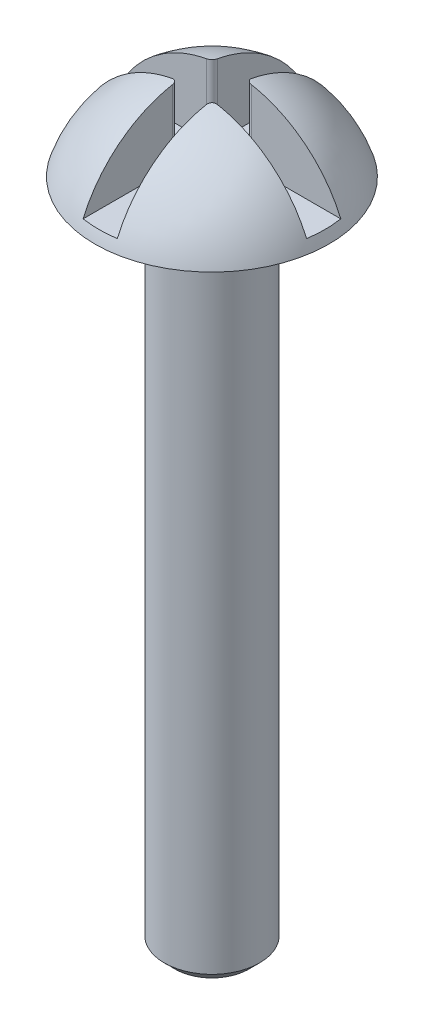
ISO-10303-21;
HEADER;
FILE_DESCRIPTION(('STEP AP214'),'2;1');
FILE_NAME('part.step','',(''),(''),'','','');
FILE_SCHEMA(('AUTOMOTIVE_DESIGN { 1 0 10303 214 1 1 1 1 }'));
ENDSEC;
DATA;
#1=APPLICATION_CONTEXT('core data for automotive mechanical design processes');
#2=APPLICATION_PROTOCOL_DEFINITION('international standard','automotive_design',2000,#1);
#3=PRODUCT_CONTEXT('',#1,'mechanical');
#4=PRODUCT('Part','Part','',(#3));
#5=PRODUCT_RELATED_PRODUCT_CATEGORY('part','',(#4));
#6=PRODUCT_DEFINITION_FORMATION('','',#4);
#7=PRODUCT_DEFINITION_CONTEXT('part definition',#1,'design');
#8=PRODUCT_DEFINITION('design','',#6,#7);
#9=PRODUCT_DEFINITION_SHAPE('','',#8);
#10=(LENGTH_UNIT() NAMED_UNIT(*) SI_UNIT(.MILLI.,.METRE.));
#11=(NAMED_UNIT(*) PLANE_ANGLE_UNIT() SI_UNIT($,.RADIAN.));
#12=(NAMED_UNIT(*) SI_UNIT($,.STERADIAN.) SOLID_ANGLE_UNIT());
#13=UNCERTAINTY_MEASURE_WITH_UNIT(LENGTH_MEASURE(1.E-05),#10,'distance_accuracy_value','');
#14=(GEOMETRIC_REPRESENTATION_CONTEXT(3) GLOBAL_UNCERTAINTY_ASSIGNED_CONTEXT((#13)) GLOBAL_UNIT_ASSIGNED_CONTEXT((#10,
#11,#12)) REPRESENTATION_CONTEXT('',''));
#15=CARTESIAN_POINT('',(0.,0.,0.));
#16=DIRECTION('',(0.,0.,1.));
#17=DIRECTION('',(1.,0.,0.));
#18=AXIS2_PLACEMENT_3D('',#15,#16,#17);
#19=CARTESIAN_POINT('',(0.,-0.8874521875,0.));
#20=DIRECTION('',(0.,1.,0.));
#21=DIRECTION('',(0.,0.,-1.));
#22=AXIS2_PLACEMENT_3D('',#19,#20,#21);
#23=SPHERICAL_SURFACE('',#22,2.9194521875);
#24=CARTESIAN_POINT('',(0.,0.,0.));
#25=DIRECTION('',(0.,1.,0.));
#26=DIRECTION('',(0.,0.,1.));
#27=AXIS2_PLACEMENT_3D('',#24,#25,#26);
#28=CIRCLE('',#27,2.7813);
#29=CARTESIAN_POINT('',(0.,0.,2.7813));
#30=VERTEX_POINT('',#29);
#31=EDGE_CURVE('E141',#30,#30,#28,.T.);
#32=ORIENTED_EDGE('',*,*,#31,.T.);
#33=EDGE_LOOP('',(#32));
#34=FACE_BOUND('',#33,.T.);
#35=CARTESIAN_POINT('',(0.,-0.8874521875,0.4064));
#36=DIRECTION('',(0.,0.,-1.));
#37=DIRECTION('',(-1.,0.,0.));
#38=AXIS2_PLACEMENT_3D('',#35,#36,#37);
#39=CIRCLE('',#38,2.89102751891063);
#40=CARTESIAN_POINT('',(0.5334,1.95394263812676,0.4064));
#41=VERTEX_POINT('',#40);
#42=CARTESIAN_POINT('',(2.65614890748806,0.254,0.4064));
#43=VERTEX_POINT('',#42);
#44=EDGE_CURVE('E130',#41,#43,#39,.T.);
#45=ORIENTED_EDGE('',*,*,#44,.F.);
#46=CARTESIAN_POINT('',(0.5334,1.95394263812676,0.4064));
#47=CARTESIAN_POINT('',(0.526429818175139,1.95525229722327,0.406393656141367));
#48=CARTESIAN_POINT('',(0.519437835446964,1.95645509605652,0.406973594128656));
#49=CARTESIAN_POINT('',(0.505606235655716,1.95861553609979,0.4092821138562));
#50=CARTESIAN_POINT('',(0.498766646008504,1.95957313351748,0.411010900579816));
#51=CARTESIAN_POINT('',(0.485430256638656,1.96121224794666,0.41559599247346));
#52=CARTESIAN_POINT('',(0.478933887553856,1.96189342496913,0.418453677685523));
#53=CARTESIAN_POINT('',(0.466492205552098,1.96295524916309,0.425222198161783));
#54=CARTESIAN_POINT('',(0.460546593915372,1.96333606009944,0.429132457981764));
#55=CARTESIAN_POINT('',(0.449486927445761,1.96378044826487,0.437816878775803));
#56=CARTESIAN_POINT('',(0.444359620352882,1.96384971613864,0.442573878351436));
#57=CARTESIAN_POINT('',(0.434956144691681,1.96368421809729,0.45286200159492));
#58=CARTESIAN_POINT('',(0.430680051299517,1.96344942534235,0.458393193563276));
#59=CARTESIAN_POINT('',(0.423132521628344,1.96268707574739,0.470014757316168));
#60=CARTESIAN_POINT('',(0.419852633333455,1.96216209494732,0.47609982079818));
#61=CARTESIAN_POINT('',(0.414329348110143,1.9608378635328,0.488695976120198));
#62=CARTESIAN_POINT('',(0.412085879160701,1.96003863198283,0.495207038321548));
#63=CARTESIAN_POINT('',(0.409056788031691,1.95839420105987,0.507011870443117));
#64=CARTESIAN_POINT('',(0.4080593321899,1.95759753777458,0.51225938370448));
#65=CARTESIAN_POINT('',(0.406730640863846,1.95586838945596,0.522808202103091));
#66=CARTESIAN_POINT('',(0.406398441009912,1.9549361031323,0.528109418162684));
#67=CARTESIAN_POINT('',(0.406399999999747,1.95394263812875,0.533400000000212));
#68=B_SPLINE_CURVE_WITH_KNOTS('',3,(#46,#47,#48,#49,#50,#51,#52,#53,#54,#55,#56,#57,#58,#59,#60,
#61,#62,#63,#64,#65,#66,#67),.UNSPECIFIED.,.F.,.F.,(4,2,2,2,2,2,2,2,2,2,4),(0.,
0.0212545383082465,0.0425128699765531,0.0637972700923001,0.0850700575426839,0.105952655327571,
0.126837096571577,0.147539053766297,0.168239572160783,0.184399511119075,0.200536007268686),.UNSPECIFIED.);
#69=CARTESIAN_POINT('',(0.4064,1.95394263812676,0.533399999999999));
#70=VERTEX_POINT('',#69);
#71=EDGE_CURVE('E199',#41,#70,#68,.T.);
#72=ORIENTED_EDGE('',*,*,#71,.T.);
#73=CARTESIAN_POINT('',(0.4064,-0.8874521875,0.));
#74=DIRECTION('',(-1.,0.,0.));
#75=DIRECTION('',(0.,0.,1.));
#76=AXIS2_PLACEMENT_3D('',#73,#74,#75);
#77=CIRCLE('',#76,2.89102751891063);
#78=CARTESIAN_POINT('',(0.4064,0.254,2.65614890748806));
#79=VERTEX_POINT('',#78);
#80=EDGE_CURVE('E157',#79,#70,#77,.T.);
#81=ORIENTED_EDGE('',*,*,#80,.F.);
#82=CARTESIAN_POINT('',(0.,0.254,0.));
#83=DIRECTION('',(0.,-1.,0.));
#84=DIRECTION('',(0.,0.,-1.));
#85=AXIS2_PLACEMENT_3D('',#82,#83,#84);
#86=CIRCLE('',#85,2.68705935527111);
#87=CARTESIAN_POINT('',(-0.4064,0.254,2.65614890748806));
#88=VERTEX_POINT('',#87);
#89=EDGE_CURVE('E133',#79,#88,#86,.T.);
#90=ORIENTED_EDGE('',*,*,#89,.T.);
#91=CARTESIAN_POINT('',(-0.4064,-0.8874521875,0.));
#92=DIRECTION('',(1.,0.,0.));
#93=DIRECTION('',(0.,0.,-1.));
#94=AXIS2_PLACEMENT_3D('',#91,#92,#93);
#95=CIRCLE('',#94,2.89102751891063);
#96=CARTESIAN_POINT('',(-0.4064,1.95394263812676,0.5334));
#97=VERTEX_POINT('',#96);
#98=EDGE_CURVE('E163',#97,#88,#95,.T.);
#99=ORIENTED_EDGE('',*,*,#98,.F.);
#100=CARTESIAN_POINT('',(-0.4064,1.95394263812676,0.5334));
#101=CARTESIAN_POINT('',(-0.406393656141367,1.95525229722327,0.526429818175139));
#102=CARTESIAN_POINT('',(-0.406973594128656,1.95645509605652,0.519437835446964));
#103=CARTESIAN_POINT('',(-0.4092821138562,1.95861553609979,0.505606235655716));
#104=CARTESIAN_POINT('',(-0.411010900579817,1.95957313351748,0.498766646008504));
#105=CARTESIAN_POINT('',(-0.41559599247346,1.96121224794666,0.485430256638656));
#106=CARTESIAN_POINT('',(-0.418453677685524,1.96189342496913,0.478933887553856));
#107=CARTESIAN_POINT('',(-0.425222198161783,1.96295524916309,0.466492205552098));
#108=CARTESIAN_POINT('',(-0.429132457981765,1.96333606009944,0.460546593915372));
#109=CARTESIAN_POINT('',(-0.437816878775803,1.96378044826487,0.449486927445761));
#110=CARTESIAN_POINT('',(-0.442573878351437,1.96384971613864,0.444359620352882));
#111=CARTESIAN_POINT('',(-0.452862001594921,1.96368421809729,0.434956144691681));
#112=CARTESIAN_POINT('',(-0.458393193563277,1.96344942534234,0.430680051299517));
#113=CARTESIAN_POINT('',(-0.470014757316169,1.96268707574739,0.423132521628344));
#114=CARTESIAN_POINT('',(-0.47609982079818,1.96216209494732,0.419852633333455));
#115=CARTESIAN_POINT('',(-0.488695976120198,1.9608378635328,0.414329348110143));
#116=CARTESIAN_POINT('',(-0.495207038321549,1.96003863198283,0.4120858791607));
#117=CARTESIAN_POINT('',(-0.507011870443117,1.95839420105987,0.409056788031691));
#118=CARTESIAN_POINT('',(-0.51225938370448,1.95759753777458,0.4080593321899));
#119=CARTESIAN_POINT('',(-0.522808202103091,1.95586838945596,0.406730640863846));
#120=CARTESIAN_POINT('',(-0.528109418162684,1.9549361031323,0.406398441009912));
#121=CARTESIAN_POINT('',(-0.533400000000212,1.95394263812875,0.406399999999747));
#122=B_SPLINE_CURVE_WITH_KNOTS('',3,(#100,#101,#102,#103,#104,#105,#106,#107,#108,#109,#110,
#111,#112,#113,#114,#115,#116,#117,#118,#119,#120,#121),.UNSPECIFIED.,.F.,.F.,(4,2,2,2,2,2,2,2,
2,2,4),(0.,0.0212545383082466,0.0425128699765532,0.0637972700923003,0.0850700575426841,
0.105952655327572,0.126837096571577,0.147539053766297,0.168239572160783,0.184399511119075,
0.200536007268686),.UNSPECIFIED.);
#123=CARTESIAN_POINT('',(-0.5334,1.95394263812676,0.4064));
#124=VERTEX_POINT('',#123);
#125=EDGE_CURVE('E177',#97,#124,#122,.T.);
#126=ORIENTED_EDGE('',*,*,#125,.T.);
#127=CARTESIAN_POINT('',(0.,-0.8874521875,0.4064));
#128=DIRECTION('',(0.,0.,-1.));
#129=DIRECTION('',(-1.,0.,0.));
#130=AXIS2_PLACEMENT_3D('',#127,#128,#129);
#131=CIRCLE('',#130,2.89102751891063);
#132=CARTESIAN_POINT('',(-2.65614890748806,0.254,0.4064));
#133=VERTEX_POINT('',#132);
#134=EDGE_CURVE('E160',#133,#124,#131,.T.);
#135=ORIENTED_EDGE('',*,*,#134,.F.);
#136=CARTESIAN_POINT('',(-2.65614890748806,0.254,-0.4064));
#137=VERTEX_POINT('',#136);
#138=EDGE_CURVE('E131',#133,#137,#86,.T.);
#139=ORIENTED_EDGE('',*,*,#138,.T.);
#140=CARTESIAN_POINT('',(0.,-0.8874521875,-0.406399999999999));
#141=DIRECTION('',(0.,0.,1.));
#142=DIRECTION('',(1.,0.,0.));
#143=AXIS2_PLACEMENT_3D('',#140,#141,#142);
#144=CIRCLE('',#143,2.89102751891063);
#145=CARTESIAN_POINT('',(-0.5334,1.95394263812676,-0.406399999999999));
#146=VERTEX_POINT('',#145);
#147=EDGE_CURVE('E146',#146,#137,#144,.T.);
#148=ORIENTED_EDGE('',*,*,#147,.F.);
#149=CARTESIAN_POINT('',(-0.5334,1.95394263812676,-0.406399999999999));
#150=CARTESIAN_POINT('',(-0.526429818175138,1.95525229722327,-0.406393656141367));
#151=CARTESIAN_POINT('',(-0.519437835446964,1.95645509605652,-0.406973594128656));
#152=CARTESIAN_POINT('',(-0.505606235655716,1.95861553609979,-0.4092821138562));
#153=CARTESIAN_POINT('',(-0.498766646008504,1.95957313351748,-0.411010900579816));
#154=CARTESIAN_POINT('',(-0.485430256638656,1.96121224794666,-0.41559599247346));
#155=CARTESIAN_POINT('',(-0.478933887553856,1.96189342496913,-0.418453677685523));
#156=CARTESIAN_POINT('',(-0.466492205552098,1.96295524916309,-0.425222198161783));
#157=CARTESIAN_POINT('',(-0.460546593915372,1.96333606009944,-0.429132457981764));
#158=CARTESIAN_POINT('',(-0.449486927445761,1.96378044826487,-0.437816878775803));
#159=CARTESIAN_POINT('',(-0.444359620352882,1.96384971613864,-0.442573878351436));
#160=CARTESIAN_POINT('',(-0.434956144691681,1.96368421809729,-0.45286200159492));
#161=CARTESIAN_POINT('',(-0.430680051299517,1.96344942534235,-0.458393193563276));
#162=CARTESIAN_POINT('',(-0.423132521628344,1.96268707574739,-0.470014757316168));
#163=CARTESIAN_POINT('',(-0.419852633333455,1.96216209494732,-0.47609982079818));
#164=CARTESIAN_POINT('',(-0.414329348110143,1.9608378635328,-0.488695976120198));
#165=CARTESIAN_POINT('',(-0.412085879160701,1.96003863198283,-0.495207038321548));
#166=CARTESIAN_POINT('',(-0.409056788031691,1.95839420105987,-0.507011870443117));
#167=CARTESIAN_POINT('',(-0.4080593321899,1.95759753777458,-0.51225938370448));
#168=CARTESIAN_POINT('',(-0.406730640863846,1.95586838945596,-0.522808202103091));
#169=CARTESIAN_POINT('',(-0.406398441009912,1.9549361031323,-0.528109418162684));
#170=CARTESIAN_POINT('',(-0.406399999999747,1.95394263812875,-0.533400000000212));
#171=B_SPLINE_CURVE_WITH_KNOTS('',3,(#149,#150,#151,#152,#153,#154,#155,#156,#157,#158,#159,
#160,#161,#162,#163,#164,#165,#166,#167,#168,#169,#170),.UNSPECIFIED.,.F.,.F.,(4,2,2,2,2,2,2,2,
2,2,4),(0.,0.0212545383082464,0.0425128699765531,0.0637972700923001,0.0850700575426839,
0.105952655327571,0.126837096571576,0.147539053766297,0.168239572160783,0.184399511119075,
0.200536007268686),.UNSPECIFIED.);
#172=CARTESIAN_POINT('',(-0.4064,1.95394263812676,-0.533399999999999));
#173=VERTEX_POINT('',#172);
#174=EDGE_CURVE('E171',#146,#173,#171,.T.);
#175=ORIENTED_EDGE('',*,*,#174,.T.);
#176=CARTESIAN_POINT('',(-0.4064,-0.8874521875,0.));
#177=DIRECTION('',(1.,0.,0.));
#178=DIRECTION('',(0.,0.,-1.));
#179=AXIS2_PLACEMENT_3D('',#176,#177,#178);
#180=CIRCLE('',#179,2.89102751891063);
#181=CARTESIAN_POINT('',(-0.4064,0.254,-2.65614890748806));
#182=VERTEX_POINT('',#181);
#183=EDGE_CURVE('E152',#182,#173,#180,.T.);
#184=ORIENTED_EDGE('',*,*,#183,.F.);
#185=CARTESIAN_POINT('',(0.4064,0.254,-2.65614890748806));
#186=VERTEX_POINT('',#185);
#187=EDGE_CURVE('E255',#182,#186,#86,.T.);
#188=ORIENTED_EDGE('',*,*,#187,.T.);
#189=CARTESIAN_POINT('',(0.4064,-0.8874521875,0.));
#190=DIRECTION('',(-1.,0.,0.));
#191=DIRECTION('',(0.,0.,1.));
#192=AXIS2_PLACEMENT_3D('',#189,#190,#191);
#193=CIRCLE('',#192,2.89102751891063);
#194=CARTESIAN_POINT('',(0.4064,1.95394263812676,-0.5334));
#195=VERTEX_POINT('',#194);
#196=EDGE_CURVE('E147',#195,#186,#193,.T.);
#197=ORIENTED_EDGE('',*,*,#196,.F.);
#198=CARTESIAN_POINT('',(0.4064,1.95394263812676,-0.5334));
#199=CARTESIAN_POINT('',(0.406393656141368,1.95525229722327,-0.526429818175138));
#200=CARTESIAN_POINT('',(0.406973594128657,1.95645509605652,-0.519437835446964));
#201=CARTESIAN_POINT('',(0.409282113856201,1.95861553609979,-0.505606235655716));
#202=CARTESIAN_POINT('',(0.411010900579817,1.95957313351748,-0.498766646008504));
#203=CARTESIAN_POINT('',(0.41559599247346,1.96121224794666,-0.485430256638656));
#204=CARTESIAN_POINT('',(0.418453677685524,1.96189342496913,-0.478933887553856));
#205=CARTESIAN_POINT('',(0.425222198161783,1.96295524916309,-0.466492205552098));
#206=CARTESIAN_POINT('',(0.429132457981765,1.96333606009944,-0.460546593915372));
#207=CARTESIAN_POINT('',(0.437816878775804,1.96378044826487,-0.449486927445761));
#208=CARTESIAN_POINT('',(0.442573878351437,1.96384971613864,-0.444359620352882));
#209=CARTESIAN_POINT('',(0.452862001594921,1.96368421809729,-0.434956144691681));
#210=CARTESIAN_POINT('',(0.458393193563277,1.96344942534234,-0.430680051299517));
#211=CARTESIAN_POINT('',(0.470014757316169,1.96268707574739,-0.423132521628343));
#212=CARTESIAN_POINT('',(0.47609982079818,1.96216209494732,-0.419852633333455));
#213=CARTESIAN_POINT('',(0.488695976120199,1.9608378635328,-0.414329348110143));
#214=CARTESIAN_POINT('',(0.495207038321549,1.96003863198283,-0.4120858791607));
#215=CARTESIAN_POINT('',(0.507011870443118,1.95839420105987,-0.409056788031691));
#216=CARTESIAN_POINT('',(0.512259383704481,1.95759753777458,-0.4080593321899));
#217=CARTESIAN_POINT('',(0.522808202103091,1.95586838945596,-0.406730640863846));
#218=CARTESIAN_POINT('',(0.528109418162684,1.9549361031323,-0.406398441009912));
#219=CARTESIAN_POINT('',(0.533400000000213,1.95394263812875,-0.406399999999747));
#220=B_SPLINE_CURVE_WITH_KNOTS('',3,(#198,#199,#200,#201,#202,#203,#204,#205,#206,#207,#208,
#209,#210,#211,#212,#213,#214,#215,#216,#217,#218,#219),.UNSPECIFIED.,.F.,.F.,(4,2,2,2,2,2,2,2,
2,2,4),(0.,0.0212545383082464,0.0425128699765531,0.0637972700923001,0.085070057542684,
0.105952655327572,0.126837096571577,0.147539053766297,0.168239572160783,0.184399511119075,
0.200536007268686),.UNSPECIFIED.);
#221=CARTESIAN_POINT('',(0.5334,1.95394263812676,-0.4064));
#222=VERTEX_POINT('',#221);
#223=EDGE_CURVE('E145',#195,#222,#220,.T.);
#224=ORIENTED_EDGE('',*,*,#223,.T.);
#225=CARTESIAN_POINT('',(0.,-0.8874521875,-0.4064));
#226=DIRECTION('',(0.,0.,1.));
#227=DIRECTION('',(1.,0.,0.));
#228=AXIS2_PLACEMENT_3D('',#225,#226,#227);
#229=CIRCLE('',#228,2.89102751891063);
#230=CARTESIAN_POINT('',(2.65614890748806,0.254,-0.4064));
#231=VERTEX_POINT('',#230);
#232=EDGE_CURVE('E138',#231,#222,#229,.T.);
#233=ORIENTED_EDGE('',*,*,#232,.F.);
#234=EDGE_CURVE('E120',#231,#43,#86,.T.);
#235=ORIENTED_EDGE('',*,*,#234,.T.);
#236=EDGE_LOOP('',(#45,#72,#81,#90,#99,#126,#135,#139,#148,#175,#184,#188,#197,#224,#233,#235));
#237=FACE_BOUND('',#236,.T.);
#238=ADVANCED_FACE('F33',(#34,#237),#23,.T.);
#239=CARTESIAN_POINT('',(0.,0.,0.));
#240=DIRECTION('',(0.,1.,0.));
#241=DIRECTION('',(0.,0.,1.));
#242=AXIS2_PLACEMENT_3D('',#239,#240,#241);
#243=PLANE('',#242);
#244=ORIENTED_EDGE('',*,*,#31,.F.);
#245=EDGE_LOOP('',(#244));
#246=FACE_BOUND('',#245,.T.);
#247=CARTESIAN_POINT('',(0.,0.,0.));
#248=DIRECTION('',(0.,1.,0.));
#249=DIRECTION('',(0.,0.,1.));
#250=AXIS2_PLACEMENT_3D('',#247,#248,#249);
#251=CIRCLE('',#250,1.1303);
#252=CARTESIAN_POINT('',(0.,0.,1.1303));
#253=VERTEX_POINT('',#252);
#254=EDGE_CURVE('E247',#253,#253,#251,.F.);
#255=ORIENTED_EDGE('',*,*,#254,.F.);
#256=EDGE_LOOP('',(#255));
#257=FACE_BOUND('',#256,.T.);
#258=ADVANCED_FACE('F186',(#246,#257),#243,.F.);
#259=CARTESIAN_POINT('',(0.,-15.875,0.));
#260=DIRECTION('',(0.,1.,0.));
#261=DIRECTION('',(0.,0.,1.));
#262=AXIS2_PLACEMENT_3D('',#259,#260,#261);
#263=CYLINDRICAL_SURFACE('',#262,1.1303);
#264=CARTESIAN_POINT('',(0.,-15.621,0.));
#265=DIRECTION('',(0.,-1.,0.));
#266=DIRECTION('',(0.,0.,-1.));
#267=AXIS2_PLACEMENT_3D('',#264,#265,#266);
#268=CIRCLE('',#267,1.1303);
#269=CARTESIAN_POINT('',(0.,-15.621,-1.1303));
#270=VERTEX_POINT('',#269);
#271=EDGE_CURVE('E253',#270,#270,#268,.F.);
#272=ORIENTED_EDGE('',*,*,#271,.T.);
#273=EDGE_LOOP('',(#272));
#274=FACE_BOUND('',#273,.T.);
#275=ORIENTED_EDGE('',*,*,#254,.T.);
#276=EDGE_LOOP('',(#275));
#277=FACE_BOUND('',#276,.T.);
#278=ADVANCED_FACE('F188',(#274,#277),#263,.T.);
#279=CARTESIAN_POINT('',(0.,-15.875,0.));
#280=DIRECTION('',(0.,-1.,0.));
#281=DIRECTION('',(0.,0.,-1.));
#282=AXIS2_PLACEMENT_3D('',#279,#280,#281);
#283=PLANE('',#282);
#284=CARTESIAN_POINT('',(0.,-15.875,0.));
#285=DIRECTION('',(0.,-1.,0.));
#286=DIRECTION('',(0.,0.,-1.));
#287=AXIS2_PLACEMENT_3D('',#284,#285,#286);
#288=CIRCLE('',#287,0.8763);
#289=CARTESIAN_POINT('',(0.,-15.875,-0.876300000000002));
#290=VERTEX_POINT('',#289);
#291=EDGE_CURVE('E250',#290,#290,#288,.T.);
#292=ORIENTED_EDGE('',*,*,#291,.T.);
#293=EDGE_LOOP('',(#292));
#294=FACE_BOUND('',#293,.T.);
#295=ADVANCED_FACE('F303',(#294),#283,.T.);
#296=CARTESIAN_POINT('',(0.,-15.875,0.));
#297=DIRECTION('',(0.,1.,0.));
#298=DIRECTION('',(0.,0.,1.));
#299=AXIS2_PLACEMENT_3D('',#296,#297,#298);
#300=CONICAL_SURFACE('',#299,0.8763,0.785398163397447);
#301=ORIENTED_EDGE('',*,*,#271,.F.);
#302=EDGE_LOOP('',(#301));
#303=FACE_BOUND('',#302,.T.);
#304=ORIENTED_EDGE('',*,*,#291,.F.);
#305=EDGE_LOOP('',(#304));
#306=FACE_BOUND('',#305,.T.);
#307=ADVANCED_FACE('F295',(#303,#306),#300,.T.);
#308=CARTESIAN_POINT('',(0.4064,2.032,-0.4064));
#309=DIRECTION('',(-1.,0.,0.));
#310=DIRECTION('',(0.,0.,1.));
#311=AXIS2_PLACEMENT_3D('',#308,#309,#310);
#312=PLANE('',#311);
#313=DIRECTION('',(0.,0.,-1.));
#314=VECTOR('',#313,1.);
#315=CARTESIAN_POINT('',(0.4064,0.254,-0.4064));
#316=LINE('',#315,#314);
#317=CARTESIAN_POINT('',(0.4064,0.254,-0.5334));
#318=VERTEX_POINT('',#317);
#319=EDGE_CURVE('E292',#318,#186,#316,.T.);
#320=ORIENTED_EDGE('',*,*,#319,.F.);
#321=DIRECTION('',(0.,-1.,0.));
#322=VECTOR('',#321,1.);
#323=CARTESIAN_POINT('',(0.4064,2.032,-0.5334));
#324=LINE('',#323,#322);
#325=EDGE_CURVE('E286',#318,#195,#324,.F.);
#326=ORIENTED_EDGE('',*,*,#325,.T.);
#327=ORIENTED_EDGE('',*,*,#196,.T.);
#328=EDGE_LOOP('',(#320,#326,#327));
#329=FACE_BOUND('',#328,.T.);
#330=ADVANCED_FACE('F291',(#329),#312,.T.);
#331=CARTESIAN_POINT('',(-0.4064,2.032,-0.406399999999999));
#332=DIRECTION('',(1.,0.,0.));
#333=DIRECTION('',(0.,0.,-1.));
#334=AXIS2_PLACEMENT_3D('',#331,#332,#333);
#335=PLANE('',#334);
#336=ORIENTED_EDGE('',*,*,#183,.T.);
#337=DIRECTION('',(0.,-1.,0.));
#338=VECTOR('',#337,1.);
#339=CARTESIAN_POINT('',(-0.4064,2.032,-0.533399999999999));
#340=LINE('',#339,#338);
#341=CARTESIAN_POINT('',(-0.4064,0.254,-0.533399999999999));
#342=VERTEX_POINT('',#341);
#343=EDGE_CURVE('E262',#173,#342,#340,.T.);
#344=ORIENTED_EDGE('',*,*,#343,.T.);
#345=DIRECTION('',(0.,0.,1.));
#346=VECTOR('',#345,1.);
#347=CARTESIAN_POINT('',(-0.4064,0.254,-0.406399999999999));
#348=LINE('',#347,#346);
#349=EDGE_CURVE('E238',#182,#342,#348,.T.);
#350=ORIENTED_EDGE('',*,*,#349,.F.);
#351=EDGE_LOOP('',(#336,#344,#350));
#352=FACE_BOUND('',#351,.T.);
#353=ADVANCED_FACE('F261',(#352),#335,.T.);
#354=CARTESIAN_POINT('',(-0.4064,2.032,-0.406399999999999));
#355=DIRECTION('',(0.,0.,1.));
#356=DIRECTION('',(1.,0.,0.));
#357=AXIS2_PLACEMENT_3D('',#354,#355,#356);
#358=PLANE('',#357);
#359=DIRECTION('',(-1.,0.,0.));
#360=VECTOR('',#359,1.);
#361=CARTESIAN_POINT('',(-0.4064,0.254,-0.406399999999999));
#362=LINE('',#361,#360);
#363=CARTESIAN_POINT('',(-0.5334,0.254,-0.406399999999999));
#364=VERTEX_POINT('',#363);
#365=EDGE_CURVE('E234',#364,#137,#362,.T.);
#366=ORIENTED_EDGE('',*,*,#365,.F.);
#367=DIRECTION('',(0.,-1.,0.));
#368=VECTOR('',#367,1.);
#369=CARTESIAN_POINT('',(-0.5334,2.032,-0.406399999999999));
#370=LINE('',#369,#368);
#371=EDGE_CURVE('E264',#364,#146,#370,.F.);
#372=ORIENTED_EDGE('',*,*,#371,.T.);
#373=ORIENTED_EDGE('',*,*,#147,.T.);
#374=EDGE_LOOP('',(#366,#372,#373));
#375=FACE_BOUND('',#374,.T.);
#376=ADVANCED_FACE('F301',(#375),#358,.T.);
#377=CARTESIAN_POINT('',(-0.4064,2.032,0.4064));
#378=DIRECTION('',(0.,0.,-1.));
#379=DIRECTION('',(-1.,0.,0.));
#380=AXIS2_PLACEMENT_3D('',#377,#378,#379);
#381=PLANE('',#380);
#382=ORIENTED_EDGE('',*,*,#134,.T.);
#383=DIRECTION('',(0.,-1.,0.));
#384=VECTOR('',#383,1.);
#385=CARTESIAN_POINT('',(-0.5334,2.032,0.4064));
#386=LINE('',#385,#384);
#387=CARTESIAN_POINT('',(-0.5334,0.254,0.4064));
#388=VERTEX_POINT('',#387);
#389=EDGE_CURVE('E223',#124,#388,#386,.T.);
#390=ORIENTED_EDGE('',*,*,#389,.T.);
#391=DIRECTION('',(1.,0.,0.));
#392=VECTOR('',#391,1.);
#393=CARTESIAN_POINT('',(-0.4064,0.254,0.4064));
#394=LINE('',#393,#392);
#395=EDGE_CURVE('E232',#133,#388,#394,.T.);
#396=ORIENTED_EDGE('',*,*,#395,.F.);
#397=EDGE_LOOP('',(#382,#390,#396));
#398=FACE_BOUND('',#397,.T.);
#399=ADVANCED_FACE('F230',(#398),#381,.T.);
#400=CARTESIAN_POINT('',(-0.4064,2.032,2.7813));
#401=DIRECTION('',(1.,0.,0.));
#402=DIRECTION('',(0.,0.,-1.));
#403=AXIS2_PLACEMENT_3D('',#400,#401,#402);
#404=PLANE('',#403);
#405=DIRECTION('',(0.,0.,1.));
#406=VECTOR('',#405,1.);
#407=CARTESIAN_POINT('',(-0.4064,0.254,2.7813));
#408=LINE('',#407,#406);
#409=CARTESIAN_POINT('',(-0.4064,0.254,0.533400000000001));
#410=VERTEX_POINT('',#409);
#411=EDGE_CURVE('E233',#410,#88,#408,.T.);
#412=ORIENTED_EDGE('',*,*,#411,.F.);
#413=DIRECTION('',(0.,-1.,0.));
#414=VECTOR('',#413,1.);
#415=CARTESIAN_POINT('',(-0.4064,2.032,0.5334));
#416=LINE('',#415,#414);
#417=EDGE_CURVE('E221',#410,#97,#416,.F.);
#418=ORIENTED_EDGE('',*,*,#417,.T.);
#419=ORIENTED_EDGE('',*,*,#98,.T.);
#420=EDGE_LOOP('',(#412,#418,#419));
#421=FACE_BOUND('',#420,.T.);
#422=ADVANCED_FACE('F275',(#421),#404,.T.);
#423=CARTESIAN_POINT('',(0.4064,2.032,2.7813));
#424=DIRECTION('',(-1.,0.,0.));
#425=DIRECTION('',(0.,0.,1.));
#426=AXIS2_PLACEMENT_3D('',#423,#424,#425);
#427=PLANE('',#426);
#428=ORIENTED_EDGE('',*,*,#80,.T.);
#429=DIRECTION('',(0.,-1.,0.));
#430=VECTOR('',#429,1.);
#431=CARTESIAN_POINT('',(0.4064,2.032,0.533399999999999));
#432=LINE('',#431,#430);
#433=CARTESIAN_POINT('',(0.4064,0.254,0.533399999999999));
#434=VERTEX_POINT('',#433);
#435=EDGE_CURVE('E166',#70,#434,#432,.T.);
#436=ORIENTED_EDGE('',*,*,#435,.T.);
#437=DIRECTION('',(0.,0.,-1.));
#438=VECTOR('',#437,1.);
#439=CARTESIAN_POINT('',(0.4064,0.254,2.7813));
#440=LINE('',#439,#438);
#441=EDGE_CURVE('E236',#79,#434,#440,.T.);
#442=ORIENTED_EDGE('',*,*,#441,.F.);
#443=EDGE_LOOP('',(#428,#436,#442));
#444=FACE_BOUND('',#443,.T.);
#445=ADVANCED_FACE('F279',(#444),#427,.T.);
#446=CARTESIAN_POINT('',(2.7813,2.032,0.4064));
#447=DIRECTION('',(0.,0.,-1.));
#448=DIRECTION('',(-1.,0.,0.));
#449=AXIS2_PLACEMENT_3D('',#446,#447,#448);
#450=PLANE('',#449);
#451=DIRECTION('',(1.,0.,0.));
#452=VECTOR('',#451,1.);
#453=CARTESIAN_POINT('',(2.7813,0.254,0.4064));
#454=LINE('',#453,#452);
#455=CARTESIAN_POINT('',(0.5334,0.254,0.4064));
#456=VERTEX_POINT('',#455);
#457=EDGE_CURVE('E125',#456,#43,#454,.T.);
#458=ORIENTED_EDGE('',*,*,#457,.F.);
#459=DIRECTION('',(0.,-1.,0.));
#460=VECTOR('',#459,1.);
#461=CARTESIAN_POINT('',(0.5334,2.032,0.4064));
#462=LINE('',#461,#460);
#463=EDGE_CURVE('E169',#456,#41,#462,.F.);
#464=ORIENTED_EDGE('',*,*,#463,.T.);
#465=ORIENTED_EDGE('',*,*,#44,.T.);
#466=EDGE_LOOP('',(#458,#464,#465));
#467=FACE_BOUND('',#466,.T.);
#468=ADVANCED_FACE('F285',(#467),#450,.T.);
#469=CARTESIAN_POINT('',(2.7813,2.032,-0.4064));
#470=DIRECTION('',(0.,0.,1.));
#471=DIRECTION('',(1.,0.,0.));
#472=AXIS2_PLACEMENT_3D('',#469,#470,#471);
#473=PLANE('',#472);
#474=ORIENTED_EDGE('',*,*,#232,.T.);
#475=DIRECTION('',(0.,-1.,0.));
#476=VECTOR('',#475,1.);
#477=CARTESIAN_POINT('',(0.5334,2.032,-0.4064));
#478=LINE('',#477,#476);
#479=CARTESIAN_POINT('',(0.5334,0.254,-0.4064));
#480=VERTEX_POINT('',#479);
#481=EDGE_CURVE('E140',#222,#480,#478,.T.);
#482=ORIENTED_EDGE('',*,*,#481,.T.);
#483=DIRECTION('',(-1.,0.,0.));
#484=VECTOR('',#483,1.);
#485=CARTESIAN_POINT('',(2.7813,0.254,-0.4064));
#486=LINE('',#485,#484);
#487=EDGE_CURVE('E123',#231,#480,#486,.T.);
#488=ORIENTED_EDGE('',*,*,#487,.F.);
#489=EDGE_LOOP('',(#474,#482,#488));
#490=FACE_BOUND('',#489,.T.);
#491=ADVANCED_FACE('F137',(#490),#473,.T.);
#492=CARTESIAN_POINT('',(0.,0.254,0.));
#493=DIRECTION('',(0.,-1.,0.));
#494=DIRECTION('',(0.,0.,-1.));
#495=AXIS2_PLACEMENT_3D('',#492,#493,#494);
#496=PLANE('',#495);
#497=ORIENTED_EDGE('',*,*,#487,.T.);
#498=CARTESIAN_POINT('',(0.5334,0.254,-0.5334));
#499=DIRECTION('',(0.,-1.,0.));
#500=DIRECTION('',(0.,0.,-1.));
#501=AXIS2_PLACEMENT_3D('',#498,#499,#500);
#502=CIRCLE('',#501,0.127);
#503=EDGE_CURVE('E272',#480,#318,#502,.T.);
#504=ORIENTED_EDGE('',*,*,#503,.T.);
#505=ORIENTED_EDGE('',*,*,#319,.T.);
#506=ORIENTED_EDGE('',*,*,#187,.F.);
#507=ORIENTED_EDGE('',*,*,#349,.T.);
#508=CARTESIAN_POINT('',(-0.5334,0.254,-0.533399999999999));
#509=DIRECTION('',(0.,-1.,0.));
#510=DIRECTION('',(0.,0.,-1.));
#511=AXIS2_PLACEMENT_3D('',#508,#509,#510);
#512=CIRCLE('',#511,0.127);
#513=EDGE_CURVE('E11',#342,#364,#512,.T.);
#514=ORIENTED_EDGE('',*,*,#513,.T.);
#515=ORIENTED_EDGE('',*,*,#365,.T.);
#516=ORIENTED_EDGE('',*,*,#138,.F.);
#517=ORIENTED_EDGE('',*,*,#395,.T.);
#518=CARTESIAN_POINT('',(-0.5334,0.254,0.5334));
#519=DIRECTION('',(0.,-1.,0.));
#520=DIRECTION('',(0.,0.,-1.));
#521=AXIS2_PLACEMENT_3D('',#518,#519,#520);
#522=CIRCLE('',#521,0.127);
#523=EDGE_CURVE('E42',#388,#410,#522,.T.);
#524=ORIENTED_EDGE('',*,*,#523,.T.);
#525=ORIENTED_EDGE('',*,*,#411,.T.);
#526=ORIENTED_EDGE('',*,*,#89,.F.);
#527=ORIENTED_EDGE('',*,*,#441,.T.);
#528=CARTESIAN_POINT('',(0.5334,0.254,0.533399999999999));
#529=DIRECTION('',(0.,-1.,0.));
#530=DIRECTION('',(0.,0.,-1.));
#531=AXIS2_PLACEMENT_3D('',#528,#529,#530);
#532=CIRCLE('',#531,0.127);
#533=EDGE_CURVE('E266',#434,#456,#532,.T.);
#534=ORIENTED_EDGE('',*,*,#533,.T.);
#535=ORIENTED_EDGE('',*,*,#457,.T.);
#536=ORIENTED_EDGE('',*,*,#234,.F.);
#537=EDGE_LOOP('',(#497,#504,#505,#506,#507,#514,#515,#516,#517,#524,#525,#526,#527,#534,#535,#536));
#538=FACE_BOUND('',#537,.T.);
#539=ADVANCED_FACE('F122',(#538),#496,.F.);
#540=CARTESIAN_POINT('',(0.5334,2.032,0.533399999999999));
#541=DIRECTION('',(0.,-1.,0.));
#542=DIRECTION('',(0.,0.,-1.));
#543=AXIS2_PLACEMENT_3D('',#540,#541,#542);
#544=CYLINDRICAL_SURFACE('',#543,0.127);
#545=ORIENTED_EDGE('',*,*,#71,.F.);
#546=ORIENTED_EDGE('',*,*,#463,.F.);
#547=ORIENTED_EDGE('',*,*,#533,.F.);
#548=ORIENTED_EDGE('',*,*,#435,.F.);
#549=EDGE_LOOP('',(#545,#546,#547,#548));
#550=FACE_BOUND('',#549,.T.);
#551=ADVANCED_FACE('F209',(#550),#544,.T.);
#552=CARTESIAN_POINT('',(0.5334,2.032,-0.5334));
#553=DIRECTION('',(0.,-1.,0.));
#554=DIRECTION('',(0.,0.,-1.));
#555=AXIS2_PLACEMENT_3D('',#552,#553,#554);
#556=CYLINDRICAL_SURFACE('',#555,0.127);
#557=ORIENTED_EDGE('',*,*,#223,.F.);
#558=ORIENTED_EDGE('',*,*,#325,.F.);
#559=ORIENTED_EDGE('',*,*,#503,.F.);
#560=ORIENTED_EDGE('',*,*,#481,.F.);
#561=EDGE_LOOP('',(#557,#558,#559,#560));
#562=FACE_BOUND('',#561,.T.);
#563=ADVANCED_FACE('F205',(#562),#556,.T.);
#564=CARTESIAN_POINT('',(-0.5334,2.032,0.5334));
#565=DIRECTION('',(0.,-1.,0.));
#566=DIRECTION('',(0.,0.,-1.));
#567=AXIS2_PLACEMENT_3D('',#564,#565,#566);
#568=CYLINDRICAL_SURFACE('',#567,0.127);
#569=ORIENTED_EDGE('',*,*,#125,.F.);
#570=ORIENTED_EDGE('',*,*,#417,.F.);
#571=ORIENTED_EDGE('',*,*,#523,.F.);
#572=ORIENTED_EDGE('',*,*,#389,.F.);
#573=EDGE_LOOP('',(#569,#570,#571,#572));
#574=FACE_BOUND('',#573,.T.);
#575=ADVANCED_FACE('F208',(#574),#568,.T.);
#576=CARTESIAN_POINT('',(-0.5334,2.032,-0.533399999999999));
#577=DIRECTION('',(0.,-1.,0.));
#578=DIRECTION('',(0.,0.,-1.));
#579=AXIS2_PLACEMENT_3D('',#576,#577,#578);
#580=CYLINDRICAL_SURFACE('',#579,0.127);
#581=ORIENTED_EDGE('',*,*,#174,.F.);
#582=ORIENTED_EDGE('',*,*,#371,.F.);
#583=ORIENTED_EDGE('',*,*,#513,.F.);
#584=ORIENTED_EDGE('',*,*,#343,.F.);
#585=EDGE_LOOP('',(#581,#582,#583,#584));
#586=FACE_BOUND('',#585,.T.);
#587=ADVANCED_FACE('F35',(#586),#580,.T.);
#588=CLOSED_SHELL('',(#238,#258,#278,#295,#307,#330,#353,#376,#399,#422,#445,#468,#491,#539,
#551,#563,#575,#587));
#589=MANIFOLD_SOLID_BREP('B2',#588);
#590=ADVANCED_BREP_SHAPE_REPRESENTATION('',(#18,#589),#14);
#591=SHAPE_DEFINITION_REPRESENTATION(#9,#590);
ENDSEC;
END-ISO-10303-21;
